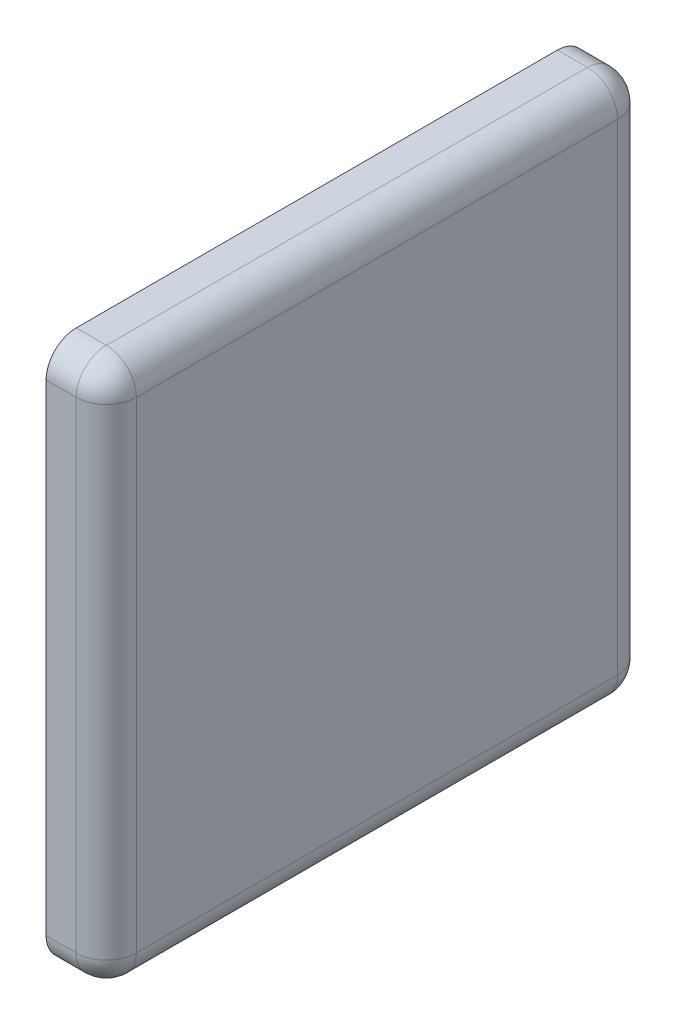
ISO-10303-21;
HEADER;
FILE_DESCRIPTION(('STEP AP214'),'2;1');
FILE_NAME('part.step','',(''),(''),'','','');
FILE_SCHEMA(('AUTOMOTIVE_DESIGN { 1 0 10303 214 1 1 1 1 }'));
ENDSEC;
DATA;
#1=APPLICATION_CONTEXT('core data for automotive mechanical design processes');
#2=APPLICATION_PROTOCOL_DEFINITION('international standard','automotive_design',2000,#1);
#3=PRODUCT_CONTEXT('',#1,'mechanical');
#4=PRODUCT('Part','Part','',(#3));
#5=PRODUCT_RELATED_PRODUCT_CATEGORY('part','',(#4));
#6=PRODUCT_DEFINITION_FORMATION('','',#4);
#7=PRODUCT_DEFINITION_CONTEXT('part definition',#1,'design');
#8=PRODUCT_DEFINITION('design','',#6,#7);
#9=PRODUCT_DEFINITION_SHAPE('','',#8);
#10=(LENGTH_UNIT() NAMED_UNIT(*) SI_UNIT(.MILLI.,.METRE.));
#11=(NAMED_UNIT(*) PLANE_ANGLE_UNIT() SI_UNIT($,.RADIAN.));
#12=(NAMED_UNIT(*) SI_UNIT($,.STERADIAN.) SOLID_ANGLE_UNIT());
#13=UNCERTAINTY_MEASURE_WITH_UNIT(LENGTH_MEASURE(1.E-05),#10,'distance_accuracy_value','');
#14=(GEOMETRIC_REPRESENTATION_CONTEXT(3) GLOBAL_UNCERTAINTY_ASSIGNED_CONTEXT((#13)) GLOBAL_UNIT_ASSIGNED_CONTEXT((#10,
#11,#12)) REPRESENTATION_CONTEXT('',''));
#15=CARTESIAN_POINT('',(0.,0.,0.));
#16=DIRECTION('',(0.,0.,1.));
#17=DIRECTION('',(1.,0.,0.));
#18=AXIS2_PLACEMENT_3D('',#15,#16,#17);
#19=CARTESIAN_POINT('',(1.7,0.,0.));
#20=DIRECTION('',(1.,0.,0.));
#21=DIRECTION('',(0.,0.,-1.));
#22=AXIS2_PLACEMENT_3D('',#19,#20,#21);
#23=PLANE('',#22);
#24=DIRECTION('',(0.,0.,1.));
#25=VECTOR('',#24,1.);
#26=CARTESIAN_POINT('',(1.7,0.85,0.));
#27=LINE('',#26,#25);
#28=CARTESIAN_POINT('',(1.7,0.85,0.85));
#29=VERTEX_POINT('',#28);
#30=CARTESIAN_POINT('',(1.7,0.85,0.05));
#31=VERTEX_POINT('',#30);
#32=EDGE_CURVE('E175',#29,#31,#27,.F.);
#33=ORIENTED_EDGE('',*,*,#32,.F.);
#34=DIRECTION('',(0.,1.,0.));
#35=VECTOR('',#34,1.);
#36=CARTESIAN_POINT('',(1.7,0.,0.85));
#37=LINE('',#36,#35);
#38=CARTESIAN_POINT('',(1.7,0.05,0.85));
#39=VERTEX_POINT('',#38);
#40=EDGE_CURVE('E165',#39,#29,#37,.T.);
#41=ORIENTED_EDGE('',*,*,#40,.F.);
#42=DIRECTION('',(0.,0.,1.));
#43=VECTOR('',#42,1.);
#44=CARTESIAN_POINT('',(1.7,0.05,0.));
#45=LINE('',#44,#43);
#46=CARTESIAN_POINT('',(1.7,0.05,0.05));
#47=VERTEX_POINT('',#46);
#48=EDGE_CURVE('E211',#47,#39,#45,.T.);
#49=ORIENTED_EDGE('',*,*,#48,.F.);
#50=DIRECTION('',(0.,1.,0.));
#51=VECTOR('',#50,1.);
#52=CARTESIAN_POINT('',(1.7,0.,0.05));
#53=LINE('',#52,#51);
#54=EDGE_CURVE('E227',#31,#47,#53,.F.);
#55=ORIENTED_EDGE('',*,*,#54,.F.);
#56=EDGE_LOOP('',(#33,#41,#49,#55));
#57=FACE_BOUND('',#56,.T.);
#58=ADVANCED_FACE('F17',(#57),#23,.T.);
#59=CARTESIAN_POINT('',(1.65,0.05,0.));
#60=DIRECTION('',(0.,0.,1.));
#61=DIRECTION('',(1.,0.,0.));
#62=AXIS2_PLACEMENT_3D('',#59,#60,#61);
#63=CYLINDRICAL_SURFACE('',#62,0.05);
#64=CARTESIAN_POINT('',(1.65,0.05,0.05));
#65=DIRECTION('',(0.,-9.5846697953635E-13,-1.));
#66=DIRECTION('',(1.,0.,0.));
#67=AXIS2_PLACEMENT_3D('',#64,#65,#66);
#68=CIRCLE('',#67,0.05);
#69=CARTESIAN_POINT('',(1.65,0.,0.050000000000012));
#70=VERTEX_POINT('',#69);
#71=EDGE_CURVE('E207',#47,#70,#68,.T.);
#72=ORIENTED_EDGE('',*,*,#71,.F.);
#73=ORIENTED_EDGE('',*,*,#48,.T.);
#74=CARTESIAN_POINT('',(1.65,0.05,0.85));
#75=DIRECTION('',(0.,0.,-1.));
#76=DIRECTION('',(1.,0.,0.));
#77=AXIS2_PLACEMENT_3D('',#74,#75,#76);
#78=CIRCLE('',#77,0.05);
#79=CARTESIAN_POINT('',(1.65,0.,0.85));
#80=VERTEX_POINT('',#79);
#81=EDGE_CURVE('E284',#80,#39,#78,.F.);
#82=ORIENTED_EDGE('',*,*,#81,.F.);
#83=DIRECTION('',(0.,0.,1.));
#84=VECTOR('',#83,1.);
#85=CARTESIAN_POINT('',(1.65,0.,0.));
#86=LINE('',#85,#84);
#87=EDGE_CURVE('E289',#80,#70,#86,.F.);
#88=ORIENTED_EDGE('',*,*,#87,.T.);
#89=EDGE_LOOP('',(#72,#73,#82,#88));
#90=FACE_BOUND('',#89,.T.);
#91=ADVANCED_FACE('F200',(#90),#63,.T.);
#92=CARTESIAN_POINT('',(1.65,0.05,0.05));
#93=DIRECTION('',(1.,0.,0.));
#94=DIRECTION('',(0.,1.,0.));
#95=AXIS2_PLACEMENT_3D('',#92,#93,#94);
#96=SPHERICAL_SURFACE('',#95,0.05);
#97=CARTESIAN_POINT('',(1.65,0.05,0.05));
#98=DIRECTION('',(1.,0.,0.));
#99=DIRECTION('',(0.,0.,-1.));
#100=AXIS2_PLACEMENT_3D('',#97,#98,#99);
#101=CIRCLE('',#100,0.05);
#102=CARTESIAN_POINT('',(1.65,0.05,0.));
#103=VERTEX_POINT('',#102);
#104=EDGE_CURVE('E124',#103,#70,#101,.F.);
#105=ORIENTED_EDGE('',*,*,#104,.F.);
#106=CARTESIAN_POINT('',(1.65,0.05,0.05));
#107=DIRECTION('',(0.,1.,0.));
#108=DIRECTION('',(0.,0.,1.));
#109=AXIS2_PLACEMENT_3D('',#106,#107,#108);
#110=CIRCLE('',#109,0.05);
#111=EDGE_CURVE('E210',#47,#103,#110,.T.);
#112=ORIENTED_EDGE('',*,*,#111,.F.);
#113=ORIENTED_EDGE('',*,*,#71,.T.);
#114=EDGE_LOOP('',(#105,#112,#113));
#115=FACE_BOUND('',#114,.T.);
#116=ADVANCED_FACE('F196',(#115),#96,.T.);
#117=CARTESIAN_POINT('',(1.65,0.,0.05));
#118=DIRECTION('',(0.,1.,0.));
#119=DIRECTION('',(0.,0.,1.));
#120=AXIS2_PLACEMENT_3D('',#117,#118,#119);
#121=CYLINDRICAL_SURFACE('',#120,0.05);
#122=CARTESIAN_POINT('',(1.65,0.85,0.05));
#123=DIRECTION('',(0.,1.,-7.66605163745165E-12));
#124=DIRECTION('',(1.,0.,0.));
#125=AXIS2_PLACEMENT_3D('',#122,#123,#124);
#126=CIRCLE('',#125,0.05);
#127=CARTESIAN_POINT('',(1.65,0.849999999999904,0.));
#128=VERTEX_POINT('',#127);
#129=EDGE_CURVE('E187',#31,#128,#126,.T.);
#130=ORIENTED_EDGE('',*,*,#129,.F.);
#131=ORIENTED_EDGE('',*,*,#54,.T.);
#132=ORIENTED_EDGE('',*,*,#111,.T.);
#133=DIRECTION('',(0.,1.,0.));
#134=VECTOR('',#133,1.);
#135=CARTESIAN_POINT('',(1.65,0.,0.));
#136=LINE('',#135,#134);
#137=EDGE_CURVE('E74',#103,#128,#136,.T.);
#138=ORIENTED_EDGE('',*,*,#137,.T.);
#139=EDGE_LOOP('',(#130,#131,#132,#138));
#140=FACE_BOUND('',#139,.T.);
#141=ADVANCED_FACE('F192',(#140),#121,.T.);
#142=CARTESIAN_POINT('',(1.65,0.85,0.05));
#143=DIRECTION('',(1.,0.,0.));
#144=DIRECTION('',(0.,1.,0.));
#145=AXIS2_PLACEMENT_3D('',#142,#143,#144);
#146=SPHERICAL_SURFACE('',#145,0.05);
#147=CARTESIAN_POINT('',(1.65,0.85,0.05));
#148=DIRECTION('',(1.,0.,0.));
#149=DIRECTION('',(0.,0.,-1.));
#150=AXIS2_PLACEMENT_3D('',#147,#148,#149);
#151=CIRCLE('',#150,0.05);
#152=CARTESIAN_POINT('',(1.65,0.9,0.05));
#153=VERTEX_POINT('',#152);
#154=EDGE_CURVE('E118',#153,#128,#151,.F.);
#155=ORIENTED_EDGE('',*,*,#154,.F.);
#156=CARTESIAN_POINT('',(1.65,0.85,0.05));
#157=DIRECTION('',(0.,0.,1.));
#158=DIRECTION('',(1.,0.,0.));
#159=AXIS2_PLACEMENT_3D('',#156,#157,#158);
#160=CIRCLE('',#159,0.05);
#161=EDGE_CURVE('E166',#31,#153,#160,.T.);
#162=ORIENTED_EDGE('',*,*,#161,.F.);
#163=ORIENTED_EDGE('',*,*,#129,.T.);
#164=EDGE_LOOP('',(#155,#162,#163));
#165=FACE_BOUND('',#164,.T.);
#166=ADVANCED_FACE('F189',(#165),#146,.T.);
#167=CARTESIAN_POINT('',(1.65,0.85,0.));
#168=DIRECTION('',(0.,0.,1.));
#169=DIRECTION('',(1.,0.,0.));
#170=AXIS2_PLACEMENT_3D('',#167,#168,#169);
#171=CYLINDRICAL_SURFACE('',#170,0.05);
#172=DIRECTION('',(0.,0.,1.));
#173=VECTOR('',#172,1.);
#174=CARTESIAN_POINT('',(1.65,0.9,0.));
#175=LINE('',#174,#173);
#176=CARTESIAN_POINT('',(1.65,0.9,0.849999999999904));
#177=VERTEX_POINT('',#176);
#178=EDGE_CURVE('E109',#177,#153,#175,.F.);
#179=ORIENTED_EDGE('',*,*,#178,.F.);
#180=CARTESIAN_POINT('',(1.65,0.85,0.85));
#181=DIRECTION('',(0.,7.66605163745165E-12,1.));
#182=DIRECTION('',(1.,0.,0.));
#183=AXIS2_PLACEMENT_3D('',#180,#181,#182);
#184=CIRCLE('',#183,0.05);
#185=EDGE_CURVE('E162',#29,#177,#184,.T.);
#186=ORIENTED_EDGE('',*,*,#185,.F.);
#187=ORIENTED_EDGE('',*,*,#32,.T.);
#188=ORIENTED_EDGE('',*,*,#161,.T.);
#189=EDGE_LOOP('',(#179,#186,#187,#188));
#190=FACE_BOUND('',#189,.T.);
#191=ADVANCED_FACE('F154',(#190),#171,.T.);
#192=CARTESIAN_POINT('',(1.65,0.85,0.85));
#193=DIRECTION('',(1.,0.,0.));
#194=DIRECTION('',(0.,0.,1.));
#195=AXIS2_PLACEMENT_3D('',#192,#193,#194);
#196=SPHERICAL_SURFACE('',#195,0.05);
#197=CARTESIAN_POINT('',(1.65,0.85,0.85));
#198=DIRECTION('',(1.,0.,0.));
#199=DIRECTION('',(0.,0.,-1.));
#200=AXIS2_PLACEMENT_3D('',#197,#198,#199);
#201=CIRCLE('',#200,0.05);
#202=CARTESIAN_POINT('',(1.65,0.85,0.9));
#203=VERTEX_POINT('',#202);
#204=EDGE_CURVE('E108',#203,#177,#201,.F.);
#205=ORIENTED_EDGE('',*,*,#204,.F.);
#206=CARTESIAN_POINT('',(1.65,0.85,0.85));
#207=DIRECTION('',(0.,1.,0.));
#208=DIRECTION('',(0.,0.,1.));
#209=AXIS2_PLACEMENT_3D('',#206,#207,#208);
#210=CIRCLE('',#209,0.05);
#211=EDGE_CURVE('E220',#29,#203,#210,.F.);
#212=ORIENTED_EDGE('',*,*,#211,.F.);
#213=ORIENTED_EDGE('',*,*,#185,.T.);
#214=EDGE_LOOP('',(#205,#212,#213));
#215=FACE_BOUND('',#214,.T.);
#216=ADVANCED_FACE('F149',(#215),#196,.T.);
#217=CARTESIAN_POINT('',(1.65,0.,0.85));
#218=DIRECTION('',(0.,1.,0.));
#219=DIRECTION('',(0.,0.,1.));
#220=AXIS2_PLACEMENT_3D('',#217,#218,#219);
#221=CYLINDRICAL_SURFACE('',#220,0.05);
#222=DIRECTION('',(0.,1.,0.));
#223=VECTOR('',#222,1.);
#224=CARTESIAN_POINT('',(1.65,0.,0.9));
#225=LINE('',#224,#223);
#226=CARTESIAN_POINT('',(1.65,0.05,0.9));
#227=VERTEX_POINT('',#226);
#228=EDGE_CURVE('E103',#227,#203,#225,.T.);
#229=ORIENTED_EDGE('',*,*,#228,.F.);
#230=CARTESIAN_POINT('',(1.65,0.05,0.85));
#231=DIRECTION('',(0.,-1.,0.));
#232=DIRECTION('',(1.,0.,0.));
#233=AXIS2_PLACEMENT_3D('',#230,#231,#232);
#234=CIRCLE('',#233,0.05);
#235=EDGE_CURVE('E136',#39,#227,#234,.T.);
#236=ORIENTED_EDGE('',*,*,#235,.F.);
#237=ORIENTED_EDGE('',*,*,#40,.T.);
#238=ORIENTED_EDGE('',*,*,#211,.T.);
#239=EDGE_LOOP('',(#229,#236,#237,#238));
#240=FACE_BOUND('',#239,.T.);
#241=ADVANCED_FACE('F144',(#240),#221,.T.);
#242=CARTESIAN_POINT('',(1.65,0.05,0.85));
#243=DIRECTION('',(1.,0.,0.));
#244=DIRECTION('',(0.,-1.,0.));
#245=AXIS2_PLACEMENT_3D('',#242,#243,#244);
#246=SPHERICAL_SURFACE('',#245,0.05);
#247=CARTESIAN_POINT('',(1.65,0.05,0.85));
#248=DIRECTION('',(1.,0.,0.));
#249=DIRECTION('',(0.,0.,-1.));
#250=AXIS2_PLACEMENT_3D('',#247,#248,#249);
#251=CIRCLE('',#250,0.05);
#252=EDGE_CURVE('E90',#80,#227,#251,.F.);
#253=ORIENTED_EDGE('',*,*,#252,.F.);
#254=ORIENTED_EDGE('',*,*,#81,.T.);
#255=ORIENTED_EDGE('',*,*,#235,.T.);
#256=EDGE_LOOP('',(#253,#254,#255));
#257=FACE_BOUND('',#256,.T.);
#258=ADVANCED_FACE('F139',(#257),#246,.T.);
#259=CARTESIAN_POINT('',(0.,0.,0.));
#260=DIRECTION('',(0.,1.,0.));
#261=DIRECTION('',(0.,0.,1.));
#262=AXIS2_PLACEMENT_3D('',#259,#260,#261);
#263=PLANE('',#262);
#264=DIRECTION('',(1.,0.,0.));
#265=VECTOR('',#264,1.);
#266=CARTESIAN_POINT('',(0.,0.,0.85));
#267=LINE('',#266,#265);
#268=CARTESIAN_POINT('',(1.6,0.,0.85));
#269=VERTEX_POINT('',#268);
#270=EDGE_CURVE('E96',#269,#80,#267,.T.);
#271=ORIENTED_EDGE('',*,*,#270,.F.);
#272=DIRECTION('',(0.,0.,-1.));
#273=VECTOR('',#272,1.);
#274=CARTESIAN_POINT('',(1.6,0.,0.));
#275=LINE('',#274,#273);
#276=CARTESIAN_POINT('',(1.6,0.,0.05));
#277=VERTEX_POINT('',#276);
#278=EDGE_CURVE('E86',#269,#277,#275,.T.);
#279=ORIENTED_EDGE('',*,*,#278,.T.);
#280=DIRECTION('',(1.,0.,0.));
#281=VECTOR('',#280,1.);
#282=CARTESIAN_POINT('',(0.,0.,0.05));
#283=LINE('',#282,#281);
#284=EDGE_CURVE('E60',#70,#277,#283,.F.);
#285=ORIENTED_EDGE('',*,*,#284,.F.);
#286=ORIENTED_EDGE('',*,*,#87,.F.);
#287=EDGE_LOOP('',(#271,#279,#285,#286));
#288=FACE_BOUND('',#287,.T.);
#289=ADVANCED_FACE('F143',(#288),#263,.F.);
#290=CARTESIAN_POINT('',(0.,0.05,0.05));
#291=DIRECTION('',(1.,0.,0.));
#292=DIRECTION('',(0.,0.,-1.));
#293=AXIS2_PLACEMENT_3D('',#290,#291,#292);
#294=CYLINDRICAL_SURFACE('',#293,0.05);
#295=ORIENTED_EDGE('',*,*,#104,.T.);
#296=ORIENTED_EDGE('',*,*,#284,.T.);
#297=CARTESIAN_POINT('',(1.6,0.05,0.05));
#298=DIRECTION('',(1.,0.,0.));
#299=DIRECTION('',(0.,0.,-1.));
#300=AXIS2_PLACEMENT_3D('',#297,#298,#299);
#301=CIRCLE('',#300,0.05);
#302=CARTESIAN_POINT('',(1.6,0.05,0.));
#303=VERTEX_POINT('',#302);
#304=EDGE_CURVE('E20',#277,#303,#301,.T.);
#305=ORIENTED_EDGE('',*,*,#304,.T.);
#306=DIRECTION('',(1.,0.,0.));
#307=VECTOR('',#306,1.);
#308=CARTESIAN_POINT('',(0.,0.05,0.));
#309=LINE('',#308,#307);
#310=EDGE_CURVE('E67',#303,#103,#309,.T.);
#311=ORIENTED_EDGE('',*,*,#310,.T.);
#312=EDGE_LOOP('',(#295,#296,#305,#311));
#313=FACE_BOUND('',#312,.T.);
#314=ADVANCED_FACE('F85',(#313),#294,.T.);
#315=CARTESIAN_POINT('',(0.,0.,0.));
#316=DIRECTION('',(0.,0.,1.));
#317=DIRECTION('',(1.,0.,0.));
#318=AXIS2_PLACEMENT_3D('',#315,#316,#317);
#319=PLANE('',#318);
#320=ORIENTED_EDGE('',*,*,#137,.F.);
#321=ORIENTED_EDGE('',*,*,#310,.F.);
#322=DIRECTION('',(0.,1.,0.));
#323=VECTOR('',#322,1.);
#324=CARTESIAN_POINT('',(1.6,0.,0.));
#325=LINE('',#324,#323);
#326=CARTESIAN_POINT('',(1.6,0.85,0.));
#327=VERTEX_POINT('',#326);
#328=EDGE_CURVE('E71',#303,#327,#325,.T.);
#329=ORIENTED_EDGE('',*,*,#328,.T.);
#330=DIRECTION('',(1.,0.,0.));
#331=VECTOR('',#330,1.);
#332=CARTESIAN_POINT('',(0.,0.85,0.));
#333=LINE('',#332,#331);
#334=EDGE_CURVE('E114',#128,#327,#333,.F.);
#335=ORIENTED_EDGE('',*,*,#334,.F.);
#336=EDGE_LOOP('',(#320,#321,#329,#335));
#337=FACE_BOUND('',#336,.T.);
#338=ADVANCED_FACE('F69',(#337),#319,.F.);
#339=CARTESIAN_POINT('',(0.,0.85,0.05));
#340=DIRECTION('',(1.,0.,0.));
#341=DIRECTION('',(0.,0.,-1.));
#342=AXIS2_PLACEMENT_3D('',#339,#340,#341);
#343=CYLINDRICAL_SURFACE('',#342,0.05);
#344=ORIENTED_EDGE('',*,*,#334,.T.);
#345=CARTESIAN_POINT('',(1.6,0.85,0.05));
#346=DIRECTION('',(1.,0.,0.));
#347=DIRECTION('',(0.,0.,-1.));
#348=AXIS2_PLACEMENT_3D('',#345,#346,#347);
#349=CIRCLE('',#348,0.05);
#350=CARTESIAN_POINT('',(1.6,0.9,0.05));
#351=VERTEX_POINT('',#350);
#352=EDGE_CURVE('E83',#327,#351,#349,.T.);
#353=ORIENTED_EDGE('',*,*,#352,.T.);
#354=DIRECTION('',(1.,0.,0.));
#355=VECTOR('',#354,1.);
#356=CARTESIAN_POINT('',(0.,0.9,0.05));
#357=LINE('',#356,#355);
#358=EDGE_CURVE('E112',#153,#351,#357,.F.);
#359=ORIENTED_EDGE('',*,*,#358,.F.);
#360=ORIENTED_EDGE('',*,*,#154,.T.);
#361=EDGE_LOOP('',(#344,#353,#359,#360));
#362=FACE_BOUND('',#361,.T.);
#363=ADVANCED_FACE('F312',(#362),#343,.T.);
#364=CARTESIAN_POINT('',(0.,0.9,0.));
#365=DIRECTION('',(0.,1.,0.));
#366=DIRECTION('',(0.,0.,1.));
#367=AXIS2_PLACEMENT_3D('',#364,#365,#366);
#368=PLANE('',#367);
#369=DIRECTION('',(1.,0.,0.));
#370=VECTOR('',#369,1.);
#371=CARTESIAN_POINT('',(0.,0.9,0.85));
#372=LINE('',#371,#370);
#373=CARTESIAN_POINT('',(1.6,0.9,0.85));
#374=VERTEX_POINT('',#373);
#375=EDGE_CURVE('E106',#177,#374,#372,.F.);
#376=ORIENTED_EDGE('',*,*,#375,.F.);
#377=ORIENTED_EDGE('',*,*,#178,.T.);
#378=ORIENTED_EDGE('',*,*,#358,.T.);
#379=DIRECTION('',(0.,0.,-1.));
#380=VECTOR('',#379,1.);
#381=CARTESIAN_POINT('',(1.6,0.9,0.));
#382=LINE('',#381,#380);
#383=EDGE_CURVE('E234',#351,#374,#382,.F.);
#384=ORIENTED_EDGE('',*,*,#383,.T.);
#385=EDGE_LOOP('',(#376,#377,#378,#384));
#386=FACE_BOUND('',#385,.T.);
#387=ADVANCED_FACE('F252',(#386),#368,.T.);
#388=CARTESIAN_POINT('',(0.,0.85,0.85));
#389=DIRECTION('',(1.,0.,0.));
#390=DIRECTION('',(0.,0.,-1.));
#391=AXIS2_PLACEMENT_3D('',#388,#389,#390);
#392=CYLINDRICAL_SURFACE('',#391,0.05);
#393=DIRECTION('',(1.,0.,0.));
#394=VECTOR('',#393,1.);
#395=CARTESIAN_POINT('',(0.,0.85,0.9));
#396=LINE('',#395,#394);
#397=CARTESIAN_POINT('',(1.6,0.85,0.9));
#398=VERTEX_POINT('',#397);
#399=EDGE_CURVE('E99',#203,#398,#396,.F.);
#400=ORIENTED_EDGE('',*,*,#399,.F.);
#401=ORIENTED_EDGE('',*,*,#204,.T.);
#402=ORIENTED_EDGE('',*,*,#375,.T.);
#403=CARTESIAN_POINT('',(1.6,0.85,0.85));
#404=DIRECTION('',(1.,0.,0.));
#405=DIRECTION('',(0.,0.,-1.));
#406=AXIS2_PLACEMENT_3D('',#403,#404,#405);
#407=CIRCLE('',#406,0.05);
#408=EDGE_CURVE('E232',#374,#398,#407,.T.);
#409=ORIENTED_EDGE('',*,*,#408,.T.);
#410=EDGE_LOOP('',(#400,#401,#402,#409));
#411=FACE_BOUND('',#410,.T.);
#412=ADVANCED_FACE('F247',(#411),#392,.T.);
#413=CARTESIAN_POINT('',(0.,0.,0.9));
#414=DIRECTION('',(0.,0.,1.));
#415=DIRECTION('',(1.,0.,0.));
#416=AXIS2_PLACEMENT_3D('',#413,#414,#415);
#417=PLANE('',#416);
#418=ORIENTED_EDGE('',*,*,#228,.T.);
#419=ORIENTED_EDGE('',*,*,#399,.T.);
#420=DIRECTION('',(0.,1.,0.));
#421=VECTOR('',#420,1.);
#422=CARTESIAN_POINT('',(1.6,0.,0.9));
#423=LINE('',#422,#421);
#424=CARTESIAN_POINT('',(1.6,0.05,0.9));
#425=VERTEX_POINT('',#424);
#426=EDGE_CURVE('E26',#398,#425,#423,.F.);
#427=ORIENTED_EDGE('',*,*,#426,.T.);
#428=DIRECTION('',(1.,0.,0.));
#429=VECTOR('',#428,1.);
#430=CARTESIAN_POINT('',(0.,0.05,0.9));
#431=LINE('',#430,#429);
#432=EDGE_CURVE('E34',#227,#425,#431,.F.);
#433=ORIENTED_EDGE('',*,*,#432,.F.);
#434=EDGE_LOOP('',(#418,#419,#427,#433));
#435=FACE_BOUND('',#434,.T.);
#436=ADVANCED_FACE('F243',(#435),#417,.T.);
#437=CARTESIAN_POINT('',(0.,0.05,0.85));
#438=DIRECTION('',(1.,0.,0.));
#439=DIRECTION('',(0.,0.,-1.));
#440=AXIS2_PLACEMENT_3D('',#437,#438,#439);
#441=CYLINDRICAL_SURFACE('',#440,0.05);
#442=ORIENTED_EDGE('',*,*,#432,.T.);
#443=CARTESIAN_POINT('',(1.6,0.05,0.85));
#444=DIRECTION('',(1.,0.,0.));
#445=DIRECTION('',(0.,0.,-1.));
#446=AXIS2_PLACEMENT_3D('',#443,#444,#445);
#447=CIRCLE('',#446,0.05);
#448=EDGE_CURVE('E11',#425,#269,#447,.T.);
#449=ORIENTED_EDGE('',*,*,#448,.T.);
#450=ORIENTED_EDGE('',*,*,#270,.T.);
#451=ORIENTED_EDGE('',*,*,#252,.T.);
#452=EDGE_LOOP('',(#442,#449,#450,#451));
#453=FACE_BOUND('',#452,.T.);
#454=ADVANCED_FACE('F323',(#453),#441,.T.);
#455=CARTESIAN_POINT('',(1.6,0.,0.));
#456=DIRECTION('',(1.,0.,0.));
#457=DIRECTION('',(0.,0.,-1.));
#458=AXIS2_PLACEMENT_3D('',#455,#456,#457);
#459=PLANE('',#458);
#460=ORIENTED_EDGE('',*,*,#426,.F.);
#461=ORIENTED_EDGE('',*,*,#408,.F.);
#462=ORIENTED_EDGE('',*,*,#383,.F.);
#463=ORIENTED_EDGE('',*,*,#352,.F.);
#464=ORIENTED_EDGE('',*,*,#328,.F.);
#465=ORIENTED_EDGE('',*,*,#304,.F.);
#466=ORIENTED_EDGE('',*,*,#278,.F.);
#467=ORIENTED_EDGE('',*,*,#448,.F.);
#468=EDGE_LOOP('',(#460,#461,#462,#463,#464,#465,#466,#467));
#469=FACE_BOUND('',#468,.T.);
#470=ADVANCED_FACE('F79',(#469),#459,.F.);
#471=CLOSED_SHELL('',(#58,#91,#116,#141,#166,#191,#216,#241,#258,#289,#314,#338,#363,#387,#412,
#436,#454,#470));
#472=MANIFOLD_SOLID_BREP('B1',#471);
#473=ADVANCED_BREP_SHAPE_REPRESENTATION('',(#18,#472),#14);
#474=SHAPE_DEFINITION_REPRESENTATION(#9,#473);
ENDSEC;
END-ISO-10303-21;
